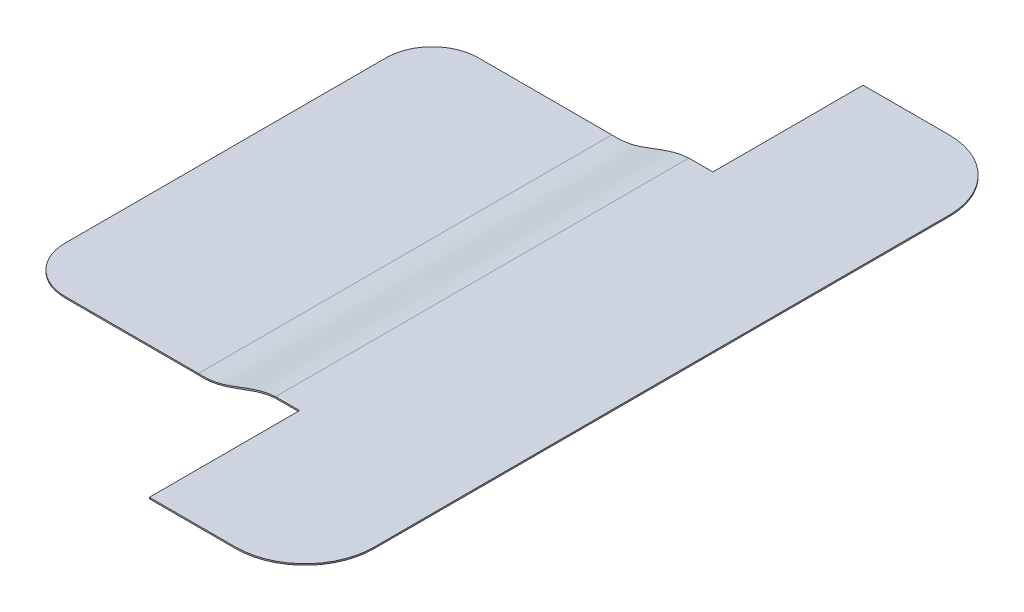
ISO-10303-21;
HEADER;
FILE_DESCRIPTION(('STEP AP214'),'2;1');
FILE_NAME('part.step','',(''),(''),'','','');
FILE_SCHEMA(('AUTOMOTIVE_DESIGN { 1 0 10303 214 1 1 1 1 }'));
ENDSEC;
DATA;
#1=APPLICATION_CONTEXT('core data for automotive mechanical design processes');
#2=APPLICATION_PROTOCOL_DEFINITION('international standard','automotive_design',2000,#1);
#3=PRODUCT_CONTEXT('',#1,'mechanical');
#4=PRODUCT('Part','Part','',(#3));
#5=PRODUCT_RELATED_PRODUCT_CATEGORY('part','',(#4));
#6=PRODUCT_DEFINITION_FORMATION('','',#4);
#7=PRODUCT_DEFINITION_CONTEXT('part definition',#1,'design');
#8=PRODUCT_DEFINITION('design','',#6,#7);
#9=PRODUCT_DEFINITION_SHAPE('','',#8);
#10=(LENGTH_UNIT() NAMED_UNIT(*) SI_UNIT(.MILLI.,.METRE.));
#11=(NAMED_UNIT(*) PLANE_ANGLE_UNIT() SI_UNIT($,.RADIAN.));
#12=(NAMED_UNIT(*) SI_UNIT($,.STERADIAN.) SOLID_ANGLE_UNIT());
#13=UNCERTAINTY_MEASURE_WITH_UNIT(LENGTH_MEASURE(1.E-05),#10,'distance_accuracy_value','');
#14=(GEOMETRIC_REPRESENTATION_CONTEXT(3) GLOBAL_UNCERTAINTY_ASSIGNED_CONTEXT((#13)) GLOBAL_UNIT_ASSIGNED_CONTEXT((#10,
#11,#12)) REPRESENTATION_CONTEXT('',''));
#15=CARTESIAN_POINT('',(0.,0.,0.));
#16=DIRECTION('',(0.,0.,1.));
#17=DIRECTION('',(1.,0.,0.));
#18=AXIS2_PLACEMENT_3D('',#15,#16,#17);
#19=CARTESIAN_POINT('',(-1.42759711710343,0.,15.5));
#20=DIRECTION('',(1.,0.,0.));
#21=DIRECTION('',(0.,0.,-1.));
#22=AXIS2_PLACEMENT_3D('',#19,#20,#21);
#23=PLANE('',#22);
#24=DIRECTION('',(0.,0.,-1.));
#25=VECTOR('',#24,1.);
#26=CARTESIAN_POINT('',(-1.42759711710343,-0.03,15.5));
#27=LINE('',#26,#25);
#28=CARTESIAN_POINT('',(-1.42759711710343,-0.03,11.2381758716454));
#29=VERTEX_POINT('',#28);
#30=CARTESIAN_POINT('',(-1.42759711710343,-0.03,4.26182412835456));
#31=VERTEX_POINT('',#30);
#32=EDGE_CURVE('E308',#29,#31,#27,.T.);
#33=ORIENTED_EDGE('',*,*,#32,.F.);
#34=DIRECTION('',(0.,1.,0.));
#35=VECTOR('',#34,1.);
#36=CARTESIAN_POINT('',(-1.42759711710343,0.,11.2381758716454));
#37=LINE('',#36,#35);
#38=CARTESIAN_POINT('',(-1.42759711710343,0.,11.2381758716454));
#39=VERTEX_POINT('',#38);
#40=EDGE_CURVE('E267',#29,#39,#37,.T.);
#41=ORIENTED_EDGE('',*,*,#40,.T.);
#42=DIRECTION('',(0.,0.,-1.));
#43=VECTOR('',#42,1.);
#44=CARTESIAN_POINT('',(-1.42759711710343,0.,15.5));
#45=LINE('',#44,#43);
#46=CARTESIAN_POINT('',(-1.42759711710343,0.,4.26182412835456));
#47=VERTEX_POINT('',#46);
#48=EDGE_CURVE('E324',#39,#47,#45,.T.);
#49=ORIENTED_EDGE('',*,*,#48,.T.);
#50=DIRECTION('',(0.,-1.,0.));
#51=VECTOR('',#50,1.);
#52=CARTESIAN_POINT('',(-1.42759711710343,0.,4.26182412835456));
#53=LINE('',#52,#51);
#54=EDGE_CURVE('E277',#47,#31,#53,.T.);
#55=ORIENTED_EDGE('',*,*,#54,.T.);
#56=EDGE_LOOP('',(#33,#41,#49,#55));
#57=FACE_BOUND('',#56,.T.);
#58=ADVANCED_FACE('F33',(#57),#23,.F.);
#59=CARTESIAN_POINT('',(-1.42759711710343,-0.03,15.5));
#60=DIRECTION('',(0.,1.,0.));
#61=DIRECTION('',(-1.,0.,0.));
#62=AXIS2_PLACEMENT_3D('',#59,#60,#61);
#63=PLANE('',#62);
#64=DIRECTION('',(-1.,0.,0.));
#65=VECTOR('',#64,1.);
#66=CARTESIAN_POINT('',(-1.42759711710343,-0.03,12.2381758716454));
#67=LINE('',#66,#65);
#68=CARTESIAN_POINT('',(2.47119503149938,-0.03,12.2381758716454));
#69=VERTEX_POINT('',#68);
#70=CARTESIAN_POINT('',(-0.427597117103426,-0.03,12.2381758716454));
#71=VERTEX_POINT('',#70);
#72=EDGE_CURVE('E177',#69,#71,#67,.T.);
#73=ORIENTED_EDGE('',*,*,#72,.T.);
#74=CARTESIAN_POINT('',(-0.427597117103426,-0.03,11.2381758716454));
#75=DIRECTION('',(0.,1.,0.));
#76=DIRECTION('',(-1.,0.,0.));
#77=AXIS2_PLACEMENT_3D('',#74,#75,#76);
#78=CIRCLE('',#77,1.);
#79=EDGE_CURVE('E41',#71,#29,#78,.F.);
#80=ORIENTED_EDGE('',*,*,#79,.T.);
#81=ORIENTED_EDGE('',*,*,#32,.T.);
#82=CARTESIAN_POINT('',(-0.427597117103426,-0.03,4.26182412835456));
#83=DIRECTION('',(0.,1.,0.));
#84=DIRECTION('',(-1.,0.,0.));
#85=AXIS2_PLACEMENT_3D('',#82,#83,#84);
#86=CIRCLE('',#85,1.);
#87=CARTESIAN_POINT('',(-0.427597117103426,-0.03,3.26182412835456));
#88=VERTEX_POINT('',#87);
#89=EDGE_CURVE('E48',#31,#88,#86,.F.);
#90=ORIENTED_EDGE('',*,*,#89,.T.);
#91=DIRECTION('',(1.,0.,0.));
#92=VECTOR('',#91,1.);
#93=CARTESIAN_POINT('',(-1.42759711710343,-0.03,3.26182412835456));
#94=LINE('',#93,#92);
#95=CARTESIAN_POINT('',(2.47119503149938,-0.03,3.26182412835456));
#96=VERTEX_POINT('',#95);
#97=EDGE_CURVE('E206',#88,#96,#94,.T.);
#98=ORIENTED_EDGE('',*,*,#97,.T.);
#99=DIRECTION('',(0.,0.,-1.));
#100=VECTOR('',#99,1.);
#101=CARTESIAN_POINT('',(2.47119503149938,-0.03,15.5));
#102=LINE('',#101,#100);
#103=EDGE_CURVE('E310',#69,#96,#102,.T.);
#104=ORIENTED_EDGE('',*,*,#103,.F.);
#105=EDGE_LOOP('',(#73,#80,#81,#90,#98,#104));
#106=FACE_BOUND('',#105,.T.);
#107=ADVANCED_FACE('F238',(#106),#63,.F.);
#108=CARTESIAN_POINT('',(2.47119503149938,-0.03,15.5));
#109=CARTESIAN_POINT('',(2.76054987352531,-0.0531942988498773,15.5));
#110=CARTESIAN_POINT('',(3.33877854067052,0.131190612309247,15.5));
#111=CARTESIAN_POINT('',(3.86267621091862,0.352698729596738,15.5));
#112=CARTESIAN_POINT('',(4.14636334698183,0.369999999996724,15.5));
#113=B_SPLINE_CURVE_WITH_KNOTS('',3,(#108,#109,#110,#111,#112),.UNSPECIFIED.,.F.,.F.,(4,1,4),
(0.0006606959636417,0.500069024061202,0.999477352158763),.UNSPECIFIED.);
#114=DIRECTION('',(0.,0.,-1.));
#115=VECTOR('',#114,1.);
#116=SURFACE_OF_LINEAR_EXTRUSION('',#113,#115);
#117=DIRECTION('',(0.,0.,-1.));
#118=VECTOR('',#117,1.);
#119=CARTESIAN_POINT('',(4.14636334698183,0.369999999996724,15.5));
#120=LINE('',#119,#118);
#121=CARTESIAN_POINT('',(4.14636334698183,0.369999999996724,12.2381758716454));
#122=VERTEX_POINT('',#121);
#123=CARTESIAN_POINT('',(4.14636334698183,0.369999999996724,3.26182412835456));
#124=VERTEX_POINT('',#123);
#125=EDGE_CURVE('E313',#122,#124,#120,.T.);
#126=ORIENTED_EDGE('',*,*,#125,.F.);
#127=CARTESIAN_POINT('',(2.47119503149938,-0.03,12.2381758716454));
#128=CARTESIAN_POINT('',(2.76054987352531,-0.0531942988498773,12.2381758716454));
#129=CARTESIAN_POINT('',(3.33877854067052,0.131190612309247,12.2381758716454));
#130=CARTESIAN_POINT('',(3.86267621091862,0.352698729596738,12.2381758716454));
#131=CARTESIAN_POINT('',(4.14636334698183,0.369999999996724,12.2381758716454));
#132=B_SPLINE_CURVE_WITH_KNOTS('',3,(#127,#128,#129,#130,#131),.UNSPECIFIED.,.F.,.F.,(4,1,4),
(0.0006606959636417,0.500069024061202,0.999477352158763),.UNSPECIFIED.);
#133=EDGE_CURVE('E182',#122,#69,#132,.F.);
#134=ORIENTED_EDGE('',*,*,#133,.T.);
#135=ORIENTED_EDGE('',*,*,#103,.T.);
#136=CARTESIAN_POINT('',(2.47119503149938,-0.03,3.26182412835456));
#137=CARTESIAN_POINT('',(2.76054987352531,-0.0531942988498773,3.26182412835456));
#138=CARTESIAN_POINT('',(3.33877854067052,0.131190612309247,3.26182412835456));
#139=CARTESIAN_POINT('',(3.86267621091862,0.352698729596738,3.26182412835456));
#140=CARTESIAN_POINT('',(4.14636334698183,0.369999999996724,3.26182412835456));
#141=B_SPLINE_CURVE_WITH_KNOTS('',3,(#136,#137,#138,#139,#140),.UNSPECIFIED.,.F.,.F.,(4,1,4),
(0.0006606959636417,0.500069024061202,0.999477352158763),.UNSPECIFIED.);
#142=EDGE_CURVE('E211',#96,#124,#141,.T.);
#143=ORIENTED_EDGE('',*,*,#142,.T.);
#144=EDGE_LOOP('',(#126,#134,#135,#143));
#145=FACE_BOUND('',#144,.T.);
#146=ADVANCED_FACE('F233',(#145),#116,.F.);
#147=CARTESIAN_POINT('',(4.14636334698183,0.369999999996724,15.5));
#148=DIRECTION('',(-8.40327401586103E-13,1.,0.));
#149=DIRECTION('',(-1.,-8.40327401586103E-13,0.));
#150=AXIS2_PLACEMENT_3D('',#147,#148,#149);
#151=PLANE('',#150);
#152=DIRECTION('',(0.,0.,-1.));
#153=VECTOR('',#152,1.);
#154=CARTESIAN_POINT('',(4.6675116807277,0.369999999997161,15.5));
#155=LINE('',#154,#153);
#156=CARTESIAN_POINT('',(4.6675116807277,0.369999999997161,15.5));
#157=VERTEX_POINT('',#156);
#158=CARTESIAN_POINT('',(4.6675116807277,0.369999999997161,12.2381758716454));
#159=VERTEX_POINT('',#158);
#160=EDGE_CURVE('E155',#157,#159,#155,.T.);
#161=ORIENTED_EDGE('',*,*,#160,.T.);
#162=DIRECTION('',(-1.,-8.40327401586103E-13,0.));
#163=VECTOR('',#162,1.);
#164=CARTESIAN_POINT('',(4.14636334698183,0.369999999996724,12.2381758716454));
#165=LINE('',#164,#163);
#166=EDGE_CURVE('E152',#159,#122,#165,.T.);
#167=ORIENTED_EDGE('',*,*,#166,.T.);
#168=ORIENTED_EDGE('',*,*,#125,.T.);
#169=DIRECTION('',(1.,8.40327401586103E-13,0.));
#170=VECTOR('',#169,1.);
#171=CARTESIAN_POINT('',(4.14636334698183,0.369999999996724,3.26182412835456));
#172=LINE('',#171,#170);
#173=CARTESIAN_POINT('',(4.6675116807277,0.369999999996942,3.26182412835456));
#174=VERTEX_POINT('',#173);
#175=EDGE_CURVE('E216',#124,#174,#172,.T.);
#176=ORIENTED_EDGE('',*,*,#175,.T.);
#177=DIRECTION('',(0.,0.,-1.));
#178=VECTOR('',#177,1.);
#179=CARTESIAN_POINT('',(4.6675116807277,0.369999999997161,15.5));
#180=LINE('',#179,#178);
#181=CARTESIAN_POINT('',(4.6675116807277,0.369999999997732,0.));
#182=VERTEX_POINT('',#181);
#183=EDGE_CURVE('E198',#174,#182,#180,.T.);
#184=ORIENTED_EDGE('',*,*,#183,.T.);
#185=DIRECTION('',(1.,8.40327401586103E-13,0.));
#186=VECTOR('',#185,1.);
#187=CARTESIAN_POINT('',(4.14636334698183,0.369999999996724,0.));
#188=LINE('',#187,#186);
#189=CARTESIAN_POINT('',(6.54545454545455,0.36999999999874,0.));
#190=VERTEX_POINT('',#189);
#191=EDGE_CURVE('E222',#182,#190,#188,.T.);
#192=ORIENTED_EDGE('',*,*,#191,.T.);
#193=CARTESIAN_POINT('',(6.54545454545455,0.36999999999874,1.5));
#194=DIRECTION('',(-8.40327401586103E-13,1.,0.));
#195=DIRECTION('',(-1.,-8.40327401586103E-13,0.));
#196=AXIS2_PLACEMENT_3D('',#193,#194,#195);
#197=CIRCLE('',#196,1.5);
#198=CARTESIAN_POINT('',(8.04545454545455,0.37,1.5));
#199=VERTEX_POINT('',#198);
#200=EDGE_CURVE('E291',#190,#199,#197,.F.);
#201=ORIENTED_EDGE('',*,*,#200,.T.);
#202=DIRECTION('',(0.,0.,-1.));
#203=VECTOR('',#202,1.);
#204=CARTESIAN_POINT('',(8.04545454545455,0.37,15.5));
#205=LINE('',#204,#203);
#206=CARTESIAN_POINT('',(8.04545454545455,0.37,14.));
#207=VERTEX_POINT('',#206);
#208=EDGE_CURVE('E315',#207,#199,#205,.T.);
#209=ORIENTED_EDGE('',*,*,#208,.F.);
#210=CARTESIAN_POINT('',(6.54545454545455,0.36999999999874,14.));
#211=DIRECTION('',(-8.40327401586103E-13,1.,0.));
#212=DIRECTION('',(-1.,-8.40327401586103E-13,0.));
#213=AXIS2_PLACEMENT_3D('',#210,#211,#212);
#214=CIRCLE('',#213,1.5);
#215=CARTESIAN_POINT('',(6.54545454545455,0.36999999999874,15.5));
#216=VERTEX_POINT('',#215);
#217=EDGE_CURVE('E293',#207,#216,#214,.F.);
#218=ORIENTED_EDGE('',*,*,#217,.T.);
#219=DIRECTION('',(1.,8.40327401586103E-13,0.));
#220=VECTOR('',#219,1.);
#221=CARTESIAN_POINT('',(4.14636334698183,0.369999999996724,15.5));
#222=LINE('',#221,#220);
#223=EDGE_CURVE('E227',#157,#216,#222,.T.);
#224=ORIENTED_EDGE('',*,*,#223,.F.);
#225=EDGE_LOOP('',(#161,#167,#168,#176,#184,#192,#201,#209,#218,#224));
#226=FACE_BOUND('',#225,.T.);
#227=ADVANCED_FACE('F237',(#226),#151,.F.);
#228=CARTESIAN_POINT('',(8.04545454545455,0.4,15.5));
#229=DIRECTION('',(-1.,0.,0.));
#230=DIRECTION('',(0.,0.,1.));
#231=AXIS2_PLACEMENT_3D('',#228,#229,#230);
#232=PLANE('',#231);
#233=ORIENTED_EDGE('',*,*,#208,.T.);
#234=DIRECTION('',(0.,1.,0.));
#235=VECTOR('',#234,1.);
#236=CARTESIAN_POINT('',(8.04545454545455,0.4,1.5));
#237=LINE('',#236,#235);
#238=CARTESIAN_POINT('',(8.04545454545455,0.4,1.5));
#239=VERTEX_POINT('',#238);
#240=EDGE_CURVE('E303',#199,#239,#237,.T.);
#241=ORIENTED_EDGE('',*,*,#240,.T.);
#242=DIRECTION('',(0.,0.,-1.));
#243=VECTOR('',#242,1.);
#244=CARTESIAN_POINT('',(8.04545454545455,0.4,15.5));
#245=LINE('',#244,#243);
#246=CARTESIAN_POINT('',(8.04545454545455,0.4,14.));
#247=VERTEX_POINT('',#246);
#248=EDGE_CURVE('E318',#247,#239,#245,.T.);
#249=ORIENTED_EDGE('',*,*,#248,.F.);
#250=DIRECTION('',(0.,1.,0.));
#251=VECTOR('',#250,1.);
#252=CARTESIAN_POINT('',(8.04545454545455,0.4,14.));
#253=LINE('',#252,#251);
#254=EDGE_CURVE('E306',#247,#207,#253,.F.);
#255=ORIENTED_EDGE('',*,*,#254,.T.);
#256=EDGE_LOOP('',(#233,#241,#249,#255));
#257=FACE_BOUND('',#256,.T.);
#258=ADVANCED_FACE('F347',(#257),#232,.F.);
#259=CARTESIAN_POINT('',(4.14545454545455,0.4,15.5));
#260=DIRECTION('',(0.,-1.,0.));
#261=DIRECTION('',(0.,0.,-1.));
#262=AXIS2_PLACEMENT_3D('',#259,#260,#261);
#263=PLANE('',#262);
#264=DIRECTION('',(0.,0.,-1.));
#265=VECTOR('',#264,1.);
#266=CARTESIAN_POINT('',(4.14545454545455,0.4,15.5));
#267=LINE('',#266,#265);
#268=CARTESIAN_POINT('',(4.14545454545455,0.4,12.2381758716454));
#269=VERTEX_POINT('',#268);
#270=CARTESIAN_POINT('',(4.14545454545455,0.4,3.26182412835456));
#271=VERTEX_POINT('',#270);
#272=EDGE_CURVE('E169',#269,#271,#267,.T.);
#273=ORIENTED_EDGE('',*,*,#272,.F.);
#274=DIRECTION('',(-1.,0.,0.));
#275=VECTOR('',#274,1.);
#276=CARTESIAN_POINT('',(-2.27096561273498,0.4,12.2381758716454));
#277=LINE('',#276,#275);
#278=CARTESIAN_POINT('',(4.6675116807277,0.4,12.2381758716454));
#279=VERTEX_POINT('',#278);
#280=EDGE_CURVE('E149',#279,#269,#277,.T.);
#281=ORIENTED_EDGE('',*,*,#280,.F.);
#282=DIRECTION('',(0.,0.,-1.));
#283=VECTOR('',#282,1.);
#284=CARTESIAN_POINT('',(4.6675116807277,0.4,16.9446954343439));
#285=LINE('',#284,#283);
#286=CARTESIAN_POINT('',(4.6675116807277,0.4,15.5));
#287=VERTEX_POINT('',#286);
#288=EDGE_CURVE('E158',#287,#279,#285,.T.);
#289=ORIENTED_EDGE('',*,*,#288,.F.);
#290=DIRECTION('',(-1.,0.,0.));
#291=VECTOR('',#290,1.);
#292=CARTESIAN_POINT('',(4.14545454545455,0.4,15.5));
#293=LINE('',#292,#291);
#294=CARTESIAN_POINT('',(6.54545454545455,0.4,15.5));
#295=VERTEX_POINT('',#294);
#296=EDGE_CURVE('E327',#295,#287,#293,.T.);
#297=ORIENTED_EDGE('',*,*,#296,.F.);
#298=CARTESIAN_POINT('',(6.54545454545455,0.4,14.));
#299=DIRECTION('',(0.,-1.,0.));
#300=DIRECTION('',(0.,0.,-1.));
#301=AXIS2_PLACEMENT_3D('',#298,#299,#300);
#302=CIRCLE('',#301,1.5);
#303=EDGE_CURVE('E301',#295,#247,#302,.F.);
#304=ORIENTED_EDGE('',*,*,#303,.T.);
#305=ORIENTED_EDGE('',*,*,#248,.T.);
#306=CARTESIAN_POINT('',(6.54545454545455,0.4,1.5));
#307=DIRECTION('',(0.,-1.,0.));
#308=DIRECTION('',(0.,0.,-1.));
#309=AXIS2_PLACEMENT_3D('',#306,#307,#308);
#310=CIRCLE('',#309,1.5);
#311=CARTESIAN_POINT('',(6.54545454545455,0.4,0.));
#312=VERTEX_POINT('',#311);
#313=EDGE_CURVE('E299',#239,#312,#310,.F.);
#314=ORIENTED_EDGE('',*,*,#313,.T.);
#315=DIRECTION('',(-1.,0.,0.));
#316=VECTOR('',#315,1.);
#317=CARTESIAN_POINT('',(4.14545454545455,0.4,0.));
#318=LINE('',#317,#316);
#319=CARTESIAN_POINT('',(4.6675116807277,0.4,0.));
#320=VERTEX_POINT('',#319);
#321=EDGE_CURVE('E328',#312,#320,#318,.T.);
#322=ORIENTED_EDGE('',*,*,#321,.T.);
#323=DIRECTION('',(0.,0.,-1.));
#324=VECTOR('',#323,1.);
#325=CARTESIAN_POINT('',(4.6675116807277,0.4,-1.4446954343439));
#326=LINE('',#325,#324);
#327=CARTESIAN_POINT('',(4.6675116807277,0.4,3.26182412835456));
#328=VERTEX_POINT('',#327);
#329=EDGE_CURVE('E194',#328,#320,#326,.T.);
#330=ORIENTED_EDGE('',*,*,#329,.F.);
#331=DIRECTION('',(1.,0.,0.));
#332=VECTOR('',#331,1.);
#333=CARTESIAN_POINT('',(-2.27096561273498,0.4,3.26182412835456));
#334=LINE('',#333,#332);
#335=EDGE_CURVE('E191',#271,#328,#334,.T.);
#336=ORIENTED_EDGE('',*,*,#335,.F.);
#337=EDGE_LOOP('',(#273,#281,#289,#297,#304,#305,#314,#322,#330,#336));
#338=FACE_BOUND('',#337,.T.);
#339=ADVANCED_FACE('F167',(#338),#263,.F.);
#340=CARTESIAN_POINT('',(4.14545454545455,0.4,15.5));
#341=CARTESIAN_POINT('',(3.56029338580876,0.364713912715539,15.5));
#342=CARTESIAN_POINT('',(3.07246043423733,-0.048698196753677,15.5));
#343=CARTESIAN_POINT('',(2.47240288289657,0.,15.5));
#344=B_SPLINE_CURVE_WITH_KNOTS('',3,(#340,#341,#342,#343),.UNSPECIFIED.,.F.,.F.,(4,4),(0.,1.),.UNSPECIFIED.);
#345=DIRECTION('',(0.,0.,-1.));
#346=VECTOR('',#345,1.);
#347=SURFACE_OF_LINEAR_EXTRUSION('',#344,#346);
#348=DIRECTION('',(0.,0.,-1.));
#349=VECTOR('',#348,1.);
#350=CARTESIAN_POINT('',(2.47240288289657,0.,15.5));
#351=LINE('',#350,#349);
#352=CARTESIAN_POINT('',(2.47240288289657,0.,12.2381758716454));
#353=VERTEX_POINT('',#352);
#354=CARTESIAN_POINT('',(2.47240288289657,0.,3.26182412835456));
#355=VERTEX_POINT('',#354);
#356=EDGE_CURVE('E322',#353,#355,#351,.T.);
#357=ORIENTED_EDGE('',*,*,#356,.F.);
#358=CARTESIAN_POINT('',(4.14545454545455,0.4,12.2381758716454));
#359=CARTESIAN_POINT('',(3.56029338580876,0.364713912715539,12.2381758716454));
#360=CARTESIAN_POINT('',(3.07246043423733,-0.048698196753677,12.2381758716454));
#361=CARTESIAN_POINT('',(2.47240288289657,0.,12.2381758716454));
#362=B_SPLINE_CURVE_WITH_KNOTS('',3,(#358,#359,#360,#361),.UNSPECIFIED.,.F.,.F.,(4,4),(0.,1.),.UNSPECIFIED.);
#363=EDGE_CURVE('E173',#353,#269,#362,.F.);
#364=ORIENTED_EDGE('',*,*,#363,.T.);
#365=ORIENTED_EDGE('',*,*,#272,.T.);
#366=CARTESIAN_POINT('',(4.14545454545455,0.4,3.26182412835456));
#367=CARTESIAN_POINT('',(3.56029338580876,0.364713912715539,3.26182412835456));
#368=CARTESIAN_POINT('',(3.07246043423733,-0.048698196753677,3.26182412835456));
#369=CARTESIAN_POINT('',(2.47240288289657,0.,3.26182412835456));
#370=B_SPLINE_CURVE_WITH_KNOTS('',3,(#366,#367,#368,#369),.UNSPECIFIED.,.F.,.F.,(4,4),(0.,1.),.UNSPECIFIED.);
#371=EDGE_CURVE('E201',#271,#355,#370,.T.);
#372=ORIENTED_EDGE('',*,*,#371,.T.);
#373=EDGE_LOOP('',(#357,#364,#365,#372));
#374=FACE_BOUND('',#373,.T.);
#375=ADVANCED_FACE('F339',(#374),#347,.F.);
#376=CARTESIAN_POINT('',(-1.42759711710343,0.,15.5));
#377=DIRECTION('',(0.,-1.,0.));
#378=DIRECTION('',(0.,0.,-1.));
#379=AXIS2_PLACEMENT_3D('',#376,#377,#378);
#380=PLANE('',#379);
#381=ORIENTED_EDGE('',*,*,#48,.F.);
#382=CARTESIAN_POINT('',(-0.427597117103426,0.,11.2381758716454));
#383=DIRECTION('',(0.,-1.,0.));
#384=DIRECTION('',(0.,0.,-1.));
#385=AXIS2_PLACEMENT_3D('',#382,#383,#384);
#386=CIRCLE('',#385,1.);
#387=CARTESIAN_POINT('',(-0.427597117103426,0.,12.2381758716454));
#388=VERTEX_POINT('',#387);
#389=EDGE_CURVE('E272',#39,#388,#386,.F.);
#390=ORIENTED_EDGE('',*,*,#389,.T.);
#391=DIRECTION('',(1.,0.,0.));
#392=VECTOR('',#391,1.);
#393=CARTESIAN_POINT('',(-1.42759711710343,0.,12.2381758716454));
#394=LINE('',#393,#392);
#395=EDGE_CURVE('E280',#388,#353,#394,.T.);
#396=ORIENTED_EDGE('',*,*,#395,.T.);
#397=ORIENTED_EDGE('',*,*,#356,.T.);
#398=DIRECTION('',(-1.,0.,0.));
#399=VECTOR('',#398,1.);
#400=CARTESIAN_POINT('',(-1.42759711710343,0.,3.26182412835456));
#401=LINE('',#400,#399);
#402=CARTESIAN_POINT('',(-0.427597117103426,0.,3.26182412835456));
#403=VERTEX_POINT('',#402);
#404=EDGE_CURVE('E283',#355,#403,#401,.T.);
#405=ORIENTED_EDGE('',*,*,#404,.T.);
#406=CARTESIAN_POINT('',(-0.427597117103426,0.,4.26182412835456));
#407=DIRECTION('',(0.,-1.,0.));
#408=DIRECTION('',(0.,0.,-1.));
#409=AXIS2_PLACEMENT_3D('',#406,#407,#408);
#410=CIRCLE('',#409,1.);
#411=EDGE_CURVE('E274',#403,#47,#410,.F.);
#412=ORIENTED_EDGE('',*,*,#411,.T.);
#413=EDGE_LOOP('',(#381,#390,#396,#397,#405,#412));
#414=FACE_BOUND('',#413,.T.);
#415=ADVANCED_FACE('F343',(#414),#380,.F.);
#416=CARTESIAN_POINT('',(3.32519579144624,0.140471413841339,15.5));
#417=DIRECTION('',(0.,0.,-1.));
#418=DIRECTION('',(-1.,0.,0.));
#419=AXIS2_PLACEMENT_3D('',#416,#417,#418);
#420=PLANE('',#419);
#421=ORIENTED_EDGE('',*,*,#296,.T.);
#422=DIRECTION('',(0.,-1.,0.));
#423=VECTOR('',#422,1.);
#424=CARTESIAN_POINT('',(4.6675116807277,0.140471413841339,15.5));
#425=LINE('',#424,#423);
#426=EDGE_CURVE('E161',#287,#157,#425,.T.);
#427=ORIENTED_EDGE('',*,*,#426,.T.);
#428=ORIENTED_EDGE('',*,*,#223,.T.);
#429=DIRECTION('',(0.,1.,0.));
#430=VECTOR('',#429,1.);
#431=CARTESIAN_POINT('',(6.54545454545455,0.140471413841339,15.5));
#432=LINE('',#431,#430);
#433=EDGE_CURVE('E288',#216,#295,#432,.T.);
#434=ORIENTED_EDGE('',*,*,#433,.T.);
#435=EDGE_LOOP('',(#421,#427,#428,#434));
#436=FACE_BOUND('',#435,.T.);
#437=ADVANCED_FACE('F383',(#436),#420,.F.);
#438=CARTESIAN_POINT('',(3.32519579144624,0.140471413841339,0.));
#439=DIRECTION('',(0.,0.,-1.));
#440=DIRECTION('',(-1.,0.,0.));
#441=AXIS2_PLACEMENT_3D('',#438,#439,#440);
#442=PLANE('',#441);
#443=DIRECTION('',(0.,-1.,0.));
#444=VECTOR('',#443,1.);
#445=CARTESIAN_POINT('',(4.6675116807277,0.140471413841339,0.));
#446=LINE('',#445,#444);
#447=EDGE_CURVE('E286',#320,#182,#446,.T.);
#448=ORIENTED_EDGE('',*,*,#447,.F.);
#449=ORIENTED_EDGE('',*,*,#321,.F.);
#450=DIRECTION('',(0.,1.,0.));
#451=VECTOR('',#450,1.);
#452=CARTESIAN_POINT('',(6.54545454545455,0.37,0.));
#453=LINE('',#452,#451);
#454=EDGE_CURVE('E296',#312,#190,#453,.F.);
#455=ORIENTED_EDGE('',*,*,#454,.T.);
#456=ORIENTED_EDGE('',*,*,#191,.F.);
#457=EDGE_LOOP('',(#448,#449,#455,#456));
#458=FACE_BOUND('',#457,.T.);
#459=ADVANCED_FACE('F250',(#458),#442,.T.);
#460=CARTESIAN_POINT('',(6.54545454545455,0.4,1.5));
#461=DIRECTION('',(0.,-1.,0.));
#462=DIRECTION('',(0.,0.,-1.));
#463=AXIS2_PLACEMENT_3D('',#460,#461,#462);
#464=CYLINDRICAL_SURFACE('',#463,1.5);
#465=ORIENTED_EDGE('',*,*,#200,.F.);
#466=ORIENTED_EDGE('',*,*,#454,.F.);
#467=ORIENTED_EDGE('',*,*,#313,.F.);
#468=ORIENTED_EDGE('',*,*,#240,.F.);
#469=EDGE_LOOP('',(#465,#466,#467,#468));
#470=FACE_BOUND('',#469,.T.);
#471=ADVANCED_FACE('F246',(#470),#464,.T.);
#472=CARTESIAN_POINT('',(6.54545454545455,0.140471413841339,14.));
#473=DIRECTION('',(0.,1.,0.));
#474=DIRECTION('',(0.,0.,1.));
#475=AXIS2_PLACEMENT_3D('',#472,#473,#474);
#476=CYLINDRICAL_SURFACE('',#475,1.5);
#477=ORIENTED_EDGE('',*,*,#217,.F.);
#478=ORIENTED_EDGE('',*,*,#254,.F.);
#479=ORIENTED_EDGE('',*,*,#303,.F.);
#480=ORIENTED_EDGE('',*,*,#433,.F.);
#481=EDGE_LOOP('',(#477,#478,#479,#480));
#482=FACE_BOUND('',#481,.T.);
#483=ADVANCED_FACE('F249',(#482),#476,.T.);
#484=CARTESIAN_POINT('',(-2.27096561273498,-15.1,3.26182412835456));
#485=DIRECTION('',(0.,0.,1.));
#486=DIRECTION('',(1.,0.,0.));
#487=AXIS2_PLACEMENT_3D('',#484,#485,#486);
#488=PLANE('',#487);
#489=ORIENTED_EDGE('',*,*,#97,.F.);
#490=DIRECTION('',(0.,-1.,0.));
#491=VECTOR('',#490,1.);
#492=CARTESIAN_POINT('',(-0.427597117103426,-15.1,3.26182412835456));
#493=LINE('',#492,#491);
#494=EDGE_CURVE('E11',#88,#403,#493,.F.);
#495=ORIENTED_EDGE('',*,*,#494,.T.);
#496=ORIENTED_EDGE('',*,*,#404,.F.);
#497=ORIENTED_EDGE('',*,*,#371,.F.);
#498=ORIENTED_EDGE('',*,*,#335,.T.);
#499=DIRECTION('',(0.,1.,0.));
#500=VECTOR('',#499,1.);
#501=CARTESIAN_POINT('',(4.6675116807277,-15.1,3.26182412835456));
#502=LINE('',#501,#500);
#503=EDGE_CURVE('E196',#174,#328,#502,.T.);
#504=ORIENTED_EDGE('',*,*,#503,.F.);
#505=ORIENTED_EDGE('',*,*,#175,.F.);
#506=ORIENTED_EDGE('',*,*,#142,.F.);
#507=EDGE_LOOP('',(#489,#495,#496,#497,#498,#504,#505,#506));
#508=FACE_BOUND('',#507,.T.);
#509=ADVANCED_FACE('F253',(#508),#488,.F.);
#510=CARTESIAN_POINT('',(4.6675116807277,-15.1,-1.4446954343439));
#511=DIRECTION('',(1.,0.,0.));
#512=DIRECTION('',(0.,0.,-1.));
#513=AXIS2_PLACEMENT_3D('',#510,#511,#512);
#514=PLANE('',#513);
#515=ORIENTED_EDGE('',*,*,#503,.T.);
#516=ORIENTED_EDGE('',*,*,#329,.T.);
#517=ORIENTED_EDGE('',*,*,#447,.T.);
#518=ORIENTED_EDGE('',*,*,#183,.F.);
#519=EDGE_LOOP('',(#515,#516,#517,#518));
#520=FACE_BOUND('',#519,.T.);
#521=ADVANCED_FACE('F367',(#520),#514,.F.);
#522=CARTESIAN_POINT('',(-2.27096561273498,-15.1,12.2381758716454));
#523=DIRECTION('',(0.,0.,-1.));
#524=DIRECTION('',(-1.,0.,0.));
#525=AXIS2_PLACEMENT_3D('',#522,#523,#524);
#526=PLANE('',#525);
#527=ORIENTED_EDGE('',*,*,#395,.F.);
#528=DIRECTION('',(0.,1.,0.));
#529=VECTOR('',#528,1.);
#530=CARTESIAN_POINT('',(-0.427597117103426,-15.1,12.2381758716454));
#531=LINE('',#530,#529);
#532=EDGE_CURVE('E56',#388,#71,#531,.F.);
#533=ORIENTED_EDGE('',*,*,#532,.T.);
#534=ORIENTED_EDGE('',*,*,#72,.F.);
#535=ORIENTED_EDGE('',*,*,#133,.F.);
#536=ORIENTED_EDGE('',*,*,#166,.F.);
#537=DIRECTION('',(0.,1.,0.));
#538=VECTOR('',#537,1.);
#539=CARTESIAN_POINT('',(4.6675116807277,-15.1,12.2381758716454));
#540=LINE('',#539,#538);
#541=EDGE_CURVE('E144',#159,#279,#540,.T.);
#542=ORIENTED_EDGE('',*,*,#541,.T.);
#543=ORIENTED_EDGE('',*,*,#280,.T.);
#544=ORIENTED_EDGE('',*,*,#363,.F.);
#545=EDGE_LOOP('',(#527,#533,#534,#535,#536,#542,#543,#544));
#546=FACE_BOUND('',#545,.T.);
#547=ADVANCED_FACE('F146',(#546),#526,.F.);
#548=CARTESIAN_POINT('',(4.6675116807277,-15.1,16.9446954343439));
#549=DIRECTION('',(1.,0.,0.));
#550=DIRECTION('',(0.,0.,-1.));
#551=AXIS2_PLACEMENT_3D('',#548,#549,#550);
#552=PLANE('',#551);
#553=ORIENTED_EDGE('',*,*,#426,.F.);
#554=ORIENTED_EDGE('',*,*,#288,.T.);
#555=ORIENTED_EDGE('',*,*,#541,.F.);
#556=ORIENTED_EDGE('',*,*,#160,.F.);
#557=EDGE_LOOP('',(#553,#554,#555,#556));
#558=FACE_BOUND('',#557,.T.);
#559=ADVANCED_FACE('F159',(#558),#552,.F.);
#560=CARTESIAN_POINT('',(-0.427597117103426,0.,11.2381758716454));
#561=DIRECTION('',(0.,1.,0.));
#562=DIRECTION('',(0.,0.,1.));
#563=AXIS2_PLACEMENT_3D('',#560,#561,#562);
#564=CYLINDRICAL_SURFACE('',#563,1.);
#565=ORIENTED_EDGE('',*,*,#79,.F.);
#566=ORIENTED_EDGE('',*,*,#532,.F.);
#567=ORIENTED_EDGE('',*,*,#389,.F.);
#568=ORIENTED_EDGE('',*,*,#40,.F.);
#569=EDGE_LOOP('',(#565,#566,#567,#568));
#570=FACE_BOUND('',#569,.T.);
#571=ADVANCED_FACE('F255',(#570),#564,.T.);
#572=CARTESIAN_POINT('',(-0.427597117103426,0.,4.26182412835456));
#573=DIRECTION('',(0.,-1.,0.));
#574=DIRECTION('',(0.,0.,-1.));
#575=AXIS2_PLACEMENT_3D('',#572,#573,#574);
#576=CYLINDRICAL_SURFACE('',#575,1.);
#577=ORIENTED_EDGE('',*,*,#411,.F.);
#578=ORIENTED_EDGE('',*,*,#494,.F.);
#579=ORIENTED_EDGE('',*,*,#89,.F.);
#580=ORIENTED_EDGE('',*,*,#54,.F.);
#581=EDGE_LOOP('',(#577,#578,#579,#580));
#582=FACE_BOUND('',#581,.T.);
#583=ADVANCED_FACE('F35',(#582),#576,.T.);
#584=CLOSED_SHELL('',(#58,#107,#146,#227,#258,#339,#375,#415,#437,#459,#471,#483,#509,#521,#547,
#559,#571,#583));
#585=MANIFOLD_SOLID_BREP('B2',#584);
#586=ADVANCED_BREP_SHAPE_REPRESENTATION('',(#18,#585),#14);
#587=SHAPE_DEFINITION_REPRESENTATION(#9,#586);
ENDSEC;
END-ISO-10303-21;
